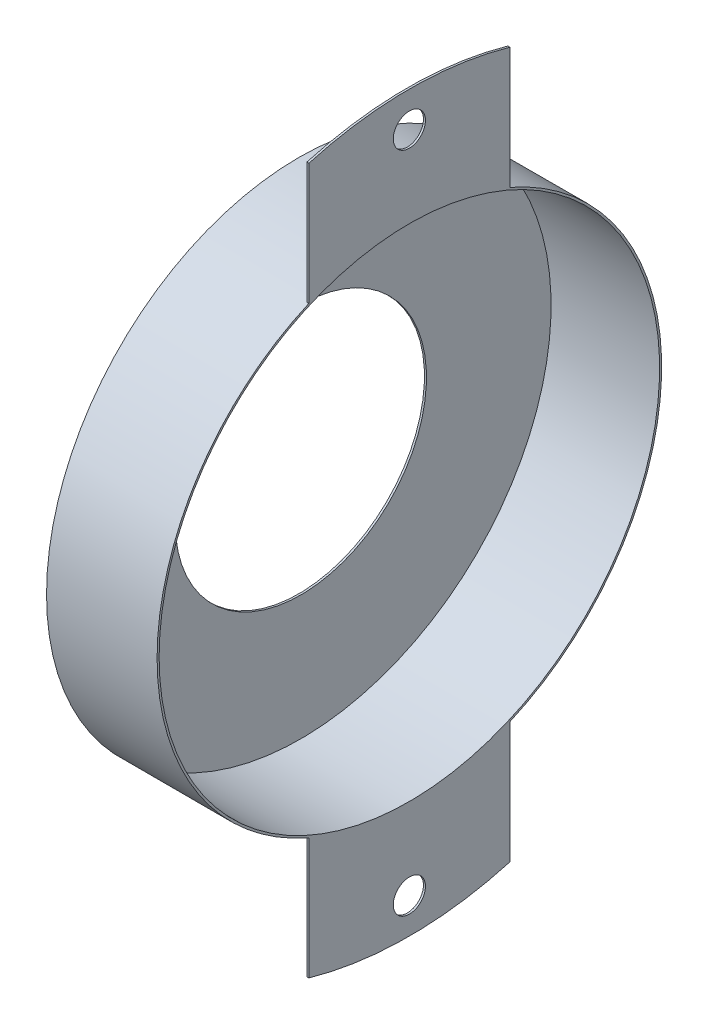
ISO-10303-21;
HEADER;
FILE_DESCRIPTION(('STEP AP214'),'2;1');
FILE_NAME('part.step','',(''),(''),'','','');
FILE_SCHEMA(('AUTOMOTIVE_DESIGN { 1 0 10303 214 1 1 1 1 }'));
ENDSEC;
DATA;
#1=APPLICATION_CONTEXT('core data for automotive mechanical design processes');
#2=APPLICATION_PROTOCOL_DEFINITION('international standard','automotive_design',2000,#1);
#3=PRODUCT_CONTEXT('',#1,'mechanical');
#4=PRODUCT('Part','Part','',(#3));
#5=PRODUCT_RELATED_PRODUCT_CATEGORY('part','',(#4));
#6=PRODUCT_DEFINITION_FORMATION('','',#4);
#7=PRODUCT_DEFINITION_CONTEXT('part definition',#1,'design');
#8=PRODUCT_DEFINITION('design','',#6,#7);
#9=PRODUCT_DEFINITION_SHAPE('','',#8);
#10=(LENGTH_UNIT() NAMED_UNIT(*) SI_UNIT(.MILLI.,.METRE.));
#11=(NAMED_UNIT(*) PLANE_ANGLE_UNIT() SI_UNIT($,.RADIAN.));
#12=(NAMED_UNIT(*) SI_UNIT($,.STERADIAN.) SOLID_ANGLE_UNIT());
#13=UNCERTAINTY_MEASURE_WITH_UNIT(LENGTH_MEASURE(1.E-05),#10,'distance_accuracy_value','');
#14=(GEOMETRIC_REPRESENTATION_CONTEXT(3) GLOBAL_UNCERTAINTY_ASSIGNED_CONTEXT((#13)) GLOBAL_UNIT_ASSIGNED_CONTEXT((#10,
#11,#12)) REPRESENTATION_CONTEXT('',''));
#15=CARTESIAN_POINT('',(0.,0.,0.));
#16=DIRECTION('',(0.,0.,1.));
#17=DIRECTION('',(1.,0.,0.));
#18=AXIS2_PLACEMENT_3D('',#15,#16,#17);
#19=CARTESIAN_POINT('',(10.9,24.9,0.));
#20=DIRECTION('',(-1.,0.,0.));
#21=DIRECTION('',(0.,0.,1.));
#22=AXIS2_PLACEMENT_3D('',#19,#20,#21);
#23=PLANE('',#22);
#24=CARTESIAN_POINT('',(10.9,33.,0.));
#25=DIRECTION('',(-1.,0.,0.));
#26=DIRECTION('',(0.,0.,1.));
#27=AXIS2_PLACEMENT_3D('',#24,#25,#26);
#28=CIRCLE('',#27,1.6);
#29=CARTESIAN_POINT('',(10.9,33.,1.6));
#30=VERTEX_POINT('',#29);
#31=EDGE_CURVE('E160',#30,#30,#28,.T.);
#32=ORIENTED_EDGE('',*,*,#31,.T.);
#33=EDGE_LOOP('',(#32));
#34=FACE_BOUND('',#33,.T.);
#35=CARTESIAN_POINT('',(10.9,-33.,0.));
#36=DIRECTION('',(-1.,0.,0.));
#37=DIRECTION('',(0.,0.,1.));
#38=AXIS2_PLACEMENT_3D('',#35,#36,#37);
#39=CIRCLE('',#38,1.6);
#40=CARTESIAN_POINT('',(10.9,-33.,1.6));
#41=VERTEX_POINT('',#40);
#42=EDGE_CURVE('E168',#41,#41,#39,.T.);
#43=ORIENTED_EDGE('',*,*,#42,.T.);
#44=EDGE_LOOP('',(#43));
#45=FACE_BOUND('',#44,.T.);
#46=CARTESIAN_POINT('',(10.9,0.,0.));
#47=DIRECTION('',(-1.,0.,0.));
#48=DIRECTION('',(0.,0.,1.));
#49=AXIS2_PLACEMENT_3D('',#46,#47,#48);
#50=CIRCLE('',#49,24.9);
#51=CARTESIAN_POINT('',(10.9,0.,24.9));
#52=VERTEX_POINT('',#51);
#53=EDGE_CURVE('E44',#52,#52,#50,.T.);
#54=ORIENTED_EDGE('',*,*,#53,.T.);
#55=EDGE_LOOP('',(#54));
#56=FACE_BOUND('',#55,.T.);
#57=DIRECTION('',(0.,-1.,0.));
#58=VECTOR('',#57,1.);
#59=CARTESIAN_POINT('',(10.9,0.,-10.));
#60=LINE('',#59,#58);
#61=CARTESIAN_POINT('',(10.9,35.1034186369362,-10.));
#62=VERTEX_POINT('',#61);
#63=CARTESIAN_POINT('',(10.9,23.0219460515396,-10.));
#64=VERTEX_POINT('',#63);
#65=EDGE_CURVE('E103',#62,#64,#60,.T.);
#66=ORIENTED_EDGE('',*,*,#65,.F.);
#67=CARTESIAN_POINT('',(10.9,0.,0.));
#68=DIRECTION('',(-1.,0.,0.));
#69=DIRECTION('',(0.,0.,1.));
#70=AXIS2_PLACEMENT_3D('',#67,#68,#69);
#71=CIRCLE('',#70,36.5);
#72=CARTESIAN_POINT('',(10.9,35.1034186369362,10.));
#73=VERTEX_POINT('',#72);
#74=EDGE_CURVE('E117',#73,#62,#71,.T.);
#75=ORIENTED_EDGE('',*,*,#74,.F.);
#76=DIRECTION('',(0.,-1.,0.));
#77=VECTOR('',#76,1.);
#78=CARTESIAN_POINT('',(10.9,0.,10.));
#79=LINE('',#78,#77);
#80=CARTESIAN_POINT('',(10.9,23.0219460515396,10.));
#81=VERTEX_POINT('',#80);
#82=EDGE_CURVE('E157',#73,#81,#79,.T.);
#83=ORIENTED_EDGE('',*,*,#82,.T.);
#84=CARTESIAN_POINT('',(10.9,0.,0.));
#85=DIRECTION('',(-1.,0.,0.));
#86=DIRECTION('',(0.,0.,1.));
#87=AXIS2_PLACEMENT_3D('',#84,#85,#86);
#88=CIRCLE('',#87,25.1);
#89=CARTESIAN_POINT('',(10.9,-23.0219460515396,10.));
#90=VERTEX_POINT('',#89);
#91=EDGE_CURVE('E150',#90,#81,#88,.T.);
#92=ORIENTED_EDGE('',*,*,#91,.F.);
#93=CARTESIAN_POINT('',(10.9,-35.1034186369362,10.));
#94=VERTEX_POINT('',#93);
#95=EDGE_CURVE('E158',#90,#94,#79,.T.);
#96=ORIENTED_EDGE('',*,*,#95,.T.);
#97=CARTESIAN_POINT('',(10.9,-35.1034186369362,-10.));
#98=VERTEX_POINT('',#97);
#99=EDGE_CURVE('E123',#98,#94,#71,.T.);
#100=ORIENTED_EDGE('',*,*,#99,.F.);
#101=CARTESIAN_POINT('',(10.9,-23.0219460515396,-10.));
#102=VERTEX_POINT('',#101);
#103=EDGE_CURVE('E119',#102,#98,#60,.T.);
#104=ORIENTED_EDGE('',*,*,#103,.F.);
#105=CARTESIAN_POINT('',(10.9,0.,0.));
#106=DIRECTION('',(-1.,0.,0.));
#107=DIRECTION('',(0.,0.,1.));
#108=AXIS2_PLACEMENT_3D('',#105,#106,#107);
#109=CIRCLE('',#108,25.1);
#110=EDGE_CURVE('E111',#64,#102,#109,.T.);
#111=ORIENTED_EDGE('',*,*,#110,.F.);
#112=EDGE_LOOP('',(#66,#75,#83,#92,#96,#100,#104,#111));
#113=FACE_BOUND('',#112,.T.);
#114=ADVANCED_FACE('F36',(#34,#45,#56,#113),#23,.F.);
#115=CARTESIAN_POINT('',(0.,0.,0.));
#116=DIRECTION('',(-1.,0.,0.));
#117=DIRECTION('',(0.,0.,1.));
#118=AXIS2_PLACEMENT_3D('',#115,#116,#117);
#119=CYLINDRICAL_SURFACE('',#118,36.5);
#120=DIRECTION('',(-1.,0.,0.));
#121=VECTOR('',#120,1.);
#122=CARTESIAN_POINT('',(10.9,35.1034186369362,-10.));
#123=LINE('',#122,#121);
#124=CARTESIAN_POINT('',(10.7,35.1034186369362,-10.));
#125=VERTEX_POINT('',#124);
#126=EDGE_CURVE('E100',#62,#125,#123,.T.);
#127=ORIENTED_EDGE('',*,*,#126,.T.);
#128=CARTESIAN_POINT('',(10.7,0.,0.));
#129=DIRECTION('',(-1.,0.,0.));
#130=DIRECTION('',(0.,0.,1.));
#131=AXIS2_PLACEMENT_3D('',#128,#129,#130);
#132=CIRCLE('',#131,36.5);
#133=CARTESIAN_POINT('',(10.7,35.1034186369362,10.));
#134=VERTEX_POINT('',#133);
#135=EDGE_CURVE('E127',#134,#125,#132,.T.);
#136=ORIENTED_EDGE('',*,*,#135,.F.);
#137=DIRECTION('',(-1.,0.,0.));
#138=VECTOR('',#137,1.);
#139=CARTESIAN_POINT('',(10.9,35.1034186369362,10.));
#140=LINE('',#139,#138);
#141=EDGE_CURVE('E59',#73,#134,#140,.T.);
#142=ORIENTED_EDGE('',*,*,#141,.F.);
#143=ORIENTED_EDGE('',*,*,#74,.T.);
#144=EDGE_LOOP('',(#127,#136,#142,#143));
#145=FACE_BOUND('',#144,.T.);
#146=ADVANCED_FACE('F122',(#145),#119,.T.);
#147=DIRECTION('',(-1.,0.,0.));
#148=VECTOR('',#147,1.);
#149=CARTESIAN_POINT('',(10.9,-35.1034186369362,-10.));
#150=LINE('',#149,#148);
#151=CARTESIAN_POINT('',(10.7,-35.1034186369362,-10.));
#152=VERTEX_POINT('',#151);
#153=EDGE_CURVE('E51',#98,#152,#150,.T.);
#154=ORIENTED_EDGE('',*,*,#153,.F.);
#155=ORIENTED_EDGE('',*,*,#99,.T.);
#156=DIRECTION('',(-1.,0.,0.));
#157=VECTOR('',#156,1.);
#158=CARTESIAN_POINT('',(10.9,-35.1034186369362,10.));
#159=LINE('',#158,#157);
#160=CARTESIAN_POINT('',(10.7,-35.1034186369362,10.));
#161=VERTEX_POINT('',#160);
#162=EDGE_CURVE('E147',#94,#161,#159,.T.);
#163=ORIENTED_EDGE('',*,*,#162,.T.);
#164=EDGE_CURVE('E130',#152,#161,#132,.T.);
#165=ORIENTED_EDGE('',*,*,#164,.F.);
#166=EDGE_LOOP('',(#154,#155,#163,#165));
#167=FACE_BOUND('',#166,.T.);
#168=ADVANCED_FACE('F212',(#167),#119,.T.);
#169=CARTESIAN_POINT('',(10.7,25.1,0.));
#170=DIRECTION('',(1.,0.,0.));
#171=DIRECTION('',(0.,0.,-1.));
#172=AXIS2_PLACEMENT_3D('',#169,#170,#171);
#173=PLANE('',#172);
#174=CARTESIAN_POINT('',(10.7,33.,0.));
#175=DIRECTION('',(-1.,0.,0.));
#176=DIRECTION('',(0.,0.,1.));
#177=AXIS2_PLACEMENT_3D('',#174,#175,#176);
#178=CIRCLE('',#177,1.6);
#179=CARTESIAN_POINT('',(10.7,33.,1.6));
#180=VERTEX_POINT('',#179);
#181=EDGE_CURVE('E175',#180,#180,#178,.T.);
#182=ORIENTED_EDGE('',*,*,#181,.F.);
#183=EDGE_LOOP('',(#182));
#184=FACE_BOUND('',#183,.T.);
#185=DIRECTION('',(0.,1.,0.));
#186=VECTOR('',#185,1.);
#187=CARTESIAN_POINT('',(10.7,25.1,-10.));
#188=LINE('',#187,#186);
#189=CARTESIAN_POINT('',(10.7,23.0219460515396,-10.));
#190=VERTEX_POINT('',#189);
#191=EDGE_CURVE('E106',#190,#125,#188,.T.);
#192=ORIENTED_EDGE('',*,*,#191,.F.);
#193=CARTESIAN_POINT('',(10.7,0.,0.));
#194=DIRECTION('',(-1.,0.,0.));
#195=DIRECTION('',(0.,0.,1.));
#196=AXIS2_PLACEMENT_3D('',#193,#194,#195);
#197=CIRCLE('',#196,25.1);
#198=CARTESIAN_POINT('',(10.7,23.0219460515396,10.));
#199=VERTEX_POINT('',#198);
#200=EDGE_CURVE('E131',#199,#190,#197,.T.);
#201=ORIENTED_EDGE('',*,*,#200,.F.);
#202=DIRECTION('',(0.,1.,0.));
#203=VECTOR('',#202,1.);
#204=CARTESIAN_POINT('',(10.7,25.1,10.));
#205=LINE('',#204,#203);
#206=EDGE_CURVE('E144',#199,#134,#205,.T.);
#207=ORIENTED_EDGE('',*,*,#206,.T.);
#208=ORIENTED_EDGE('',*,*,#135,.T.);
#209=EDGE_LOOP('',(#192,#201,#207,#208));
#210=FACE_BOUND('',#209,.T.);
#211=ADVANCED_FACE('F215',(#184,#210),#173,.F.);
#212=CARTESIAN_POINT('',(10.7,-33.,0.));
#213=DIRECTION('',(-1.,0.,0.));
#214=DIRECTION('',(0.,0.,1.));
#215=AXIS2_PLACEMENT_3D('',#212,#213,#214);
#216=CIRCLE('',#215,1.6);
#217=CARTESIAN_POINT('',(10.7,-33.,1.6));
#218=VERTEX_POINT('',#217);
#219=EDGE_CURVE('E171',#218,#218,#216,.T.);
#220=ORIENTED_EDGE('',*,*,#219,.F.);
#221=EDGE_LOOP('',(#220));
#222=FACE_BOUND('',#221,.T.);
#223=DIRECTION('',(0.,1.,0.));
#224=VECTOR('',#223,1.);
#225=CARTESIAN_POINT('',(10.7,25.1,-10.));
#226=LINE('',#225,#224);
#227=CARTESIAN_POINT('',(10.7,-23.0219460515396,-10.));
#228=VERTEX_POINT('',#227);
#229=EDGE_CURVE('E139',#152,#228,#226,.T.);
#230=ORIENTED_EDGE('',*,*,#229,.F.);
#231=ORIENTED_EDGE('',*,*,#164,.T.);
#232=DIRECTION('',(0.,1.,0.));
#233=VECTOR('',#232,1.);
#234=CARTESIAN_POINT('',(10.7,25.1,10.));
#235=LINE('',#234,#233);
#236=CARTESIAN_POINT('',(10.7,-23.0219460515396,10.));
#237=VERTEX_POINT('',#236);
#238=EDGE_CURVE('E141',#161,#237,#235,.T.);
#239=ORIENTED_EDGE('',*,*,#238,.T.);
#240=EDGE_CURVE('E134',#228,#237,#197,.T.);
#241=ORIENTED_EDGE('',*,*,#240,.F.);
#242=EDGE_LOOP('',(#230,#231,#239,#241));
#243=FACE_BOUND('',#242,.T.);
#244=ADVANCED_FACE('F217',(#222,#243),#173,.F.);
#245=CARTESIAN_POINT('',(0.1,0.,0.));
#246=DIRECTION('',(-1.,0.,0.));
#247=DIRECTION('',(0.,0.,1.));
#248=AXIS2_PLACEMENT_3D('',#245,#246,#247);
#249=PLANE('',#248);
#250=CARTESIAN_POINT('',(0.0999999999999994,0.,0.));
#251=DIRECTION('',(-1.,0.,0.));
#252=DIRECTION('',(0.,0.,1.));
#253=AXIS2_PLACEMENT_3D('',#250,#251,#252);
#254=CIRCLE('',#253,12.5);
#255=CARTESIAN_POINT('',(0.0999999999999994,0.,12.5));
#256=VERTEX_POINT('',#255);
#257=EDGE_CURVE('E172',#256,#256,#254,.T.);
#258=ORIENTED_EDGE('',*,*,#257,.T.);
#259=EDGE_LOOP('',(#258));
#260=FACE_BOUND('',#259,.T.);
#261=CARTESIAN_POINT('',(0.1,0.,0.));
#262=DIRECTION('',(-1.,0.,0.));
#263=DIRECTION('',(0.,0.,1.));
#264=AXIS2_PLACEMENT_3D('',#261,#262,#263);
#265=CIRCLE('',#264,24.9);
#266=CARTESIAN_POINT('',(0.1,0.,24.9));
#267=VERTEX_POINT('',#266);
#268=EDGE_CURVE('E11',#267,#267,#265,.T.);
#269=ORIENTED_EDGE('',*,*,#268,.F.);
#270=EDGE_LOOP('',(#269));
#271=FACE_BOUND('',#270,.T.);
#272=ADVANCED_FACE('F38',(#260,#271),#249,.F.);
#273=CARTESIAN_POINT('',(0.,0.,0.));
#274=DIRECTION('',(-1.,0.,0.));
#275=DIRECTION('',(0.,0.,1.));
#276=AXIS2_PLACEMENT_3D('',#273,#274,#275);
#277=CYLINDRICAL_SURFACE('',#276,24.9);
#278=ORIENTED_EDGE('',*,*,#53,.F.);
#279=EDGE_LOOP('',(#278));
#280=FACE_BOUND('',#279,.T.);
#281=ORIENTED_EDGE('',*,*,#268,.T.);
#282=EDGE_LOOP('',(#281));
#283=FACE_BOUND('',#282,.T.);
#284=ADVANCED_FACE('F198',(#280,#283),#277,.F.);
#285=CARTESIAN_POINT('',(0.,0.,0.));
#286=DIRECTION('',(-1.,0.,0.));
#287=DIRECTION('',(0.,0.,1.));
#288=AXIS2_PLACEMENT_3D('',#285,#286,#287);
#289=CYLINDRICAL_SURFACE('',#288,25.1);
#290=ORIENTED_EDGE('',*,*,#200,.T.);
#291=DIRECTION('',(-1.,0.,0.));
#292=VECTOR('',#291,1.);
#293=CARTESIAN_POINT('',(10.9,23.0219460515396,-10.));
#294=LINE('',#293,#292);
#295=EDGE_CURVE('E146',#64,#190,#294,.T.);
#296=ORIENTED_EDGE('',*,*,#295,.F.);
#297=ORIENTED_EDGE('',*,*,#110,.T.);
#298=DIRECTION('',(-1.,0.,0.));
#299=VECTOR('',#298,1.);
#300=CARTESIAN_POINT('',(10.9,-23.0219460515396,-10.));
#301=LINE('',#300,#299);
#302=EDGE_CURVE('E163',#102,#228,#301,.T.);
#303=ORIENTED_EDGE('',*,*,#302,.T.);
#304=ORIENTED_EDGE('',*,*,#240,.T.);
#305=DIRECTION('',(-1.,0.,0.));
#306=VECTOR('',#305,1.);
#307=CARTESIAN_POINT('',(10.9,-23.0219460515396,10.));
#308=LINE('',#307,#306);
#309=EDGE_CURVE('E120',#90,#237,#308,.T.);
#310=ORIENTED_EDGE('',*,*,#309,.F.);
#311=ORIENTED_EDGE('',*,*,#91,.T.);
#312=DIRECTION('',(-1.,0.,0.));
#313=VECTOR('',#312,1.);
#314=CARTESIAN_POINT('',(10.9,23.0219460515396,10.));
#315=LINE('',#314,#313);
#316=EDGE_CURVE('E152',#81,#199,#315,.T.);
#317=ORIENTED_EDGE('',*,*,#316,.T.);
#318=EDGE_LOOP('',(#290,#296,#297,#303,#304,#310,#311,#317));
#319=FACE_BOUND('',#318,.T.);
#320=CARTESIAN_POINT('',(-0.1,0.,0.));
#321=DIRECTION('',(-1.,0.,0.));
#322=DIRECTION('',(0.,0.,1.));
#323=AXIS2_PLACEMENT_3D('',#320,#321,#322);
#324=CIRCLE('',#323,25.1);
#325=CARTESIAN_POINT('',(-0.1,0.,25.1));
#326=VERTEX_POINT('',#325);
#327=EDGE_CURVE('E135',#326,#326,#324,.T.);
#328=ORIENTED_EDGE('',*,*,#327,.F.);
#329=EDGE_LOOP('',(#328));
#330=FACE_BOUND('',#329,.T.);
#331=ADVANCED_FACE('F193',(#319,#330),#289,.T.);
#332=CARTESIAN_POINT('',(-0.1,0.,0.));
#333=DIRECTION('',(1.,0.,0.));
#334=DIRECTION('',(0.,0.,-1.));
#335=AXIS2_PLACEMENT_3D('',#332,#333,#334);
#336=PLANE('',#335);
#337=CARTESIAN_POINT('',(-0.1,0.,0.));
#338=DIRECTION('',(-1.,0.,0.));
#339=DIRECTION('',(0.,0.,1.));
#340=AXIS2_PLACEMENT_3D('',#337,#338,#339);
#341=CIRCLE('',#340,12.5);
#342=CARTESIAN_POINT('',(-0.1,0.,12.5));
#343=VERTEX_POINT('',#342);
#344=EDGE_CURVE('E182',#343,#343,#341,.T.);
#345=ORIENTED_EDGE('',*,*,#344,.F.);
#346=EDGE_LOOP('',(#345));
#347=FACE_BOUND('',#346,.T.);
#348=ORIENTED_EDGE('',*,*,#327,.T.);
#349=EDGE_LOOP('',(#348));
#350=FACE_BOUND('',#349,.T.);
#351=ADVANCED_FACE('F189',(#347,#350),#336,.F.);
#352=CARTESIAN_POINT('',(10.9,0.,10.));
#353=DIRECTION('',(0.,0.,-1.));
#354=DIRECTION('',(0.,1.,0.));
#355=AXIS2_PLACEMENT_3D('',#352,#353,#354);
#356=PLANE('',#355);
#357=ORIENTED_EDGE('',*,*,#162,.F.);
#358=ORIENTED_EDGE('',*,*,#95,.F.);
#359=ORIENTED_EDGE('',*,*,#309,.T.);
#360=ORIENTED_EDGE('',*,*,#238,.F.);
#361=EDGE_LOOP('',(#357,#358,#359,#360));
#362=FACE_BOUND('',#361,.T.);
#363=ADVANCED_FACE('F192',(#362),#356,.F.);
#364=ORIENTED_EDGE('',*,*,#316,.F.);
#365=ORIENTED_EDGE('',*,*,#82,.F.);
#366=ORIENTED_EDGE('',*,*,#141,.T.);
#367=ORIENTED_EDGE('',*,*,#206,.F.);
#368=EDGE_LOOP('',(#364,#365,#366,#367));
#369=FACE_BOUND('',#368,.T.);
#370=ADVANCED_FACE('F230',(#369),#356,.F.);
#371=CARTESIAN_POINT('',(10.9,0.,-10.));
#372=DIRECTION('',(0.,0.,-1.));
#373=DIRECTION('',(0.,1.,0.));
#374=AXIS2_PLACEMENT_3D('',#371,#372,#373);
#375=PLANE('',#374);
#376=ORIENTED_EDGE('',*,*,#191,.T.);
#377=ORIENTED_EDGE('',*,*,#126,.F.);
#378=ORIENTED_EDGE('',*,*,#65,.T.);
#379=ORIENTED_EDGE('',*,*,#295,.T.);
#380=EDGE_LOOP('',(#376,#377,#378,#379));
#381=FACE_BOUND('',#380,.T.);
#382=ADVANCED_FACE('F102',(#381),#375,.T.);
#383=ORIENTED_EDGE('',*,*,#229,.T.);
#384=ORIENTED_EDGE('',*,*,#302,.F.);
#385=ORIENTED_EDGE('',*,*,#103,.T.);
#386=ORIENTED_EDGE('',*,*,#153,.T.);
#387=EDGE_LOOP('',(#383,#384,#385,#386));
#388=FACE_BOUND('',#387,.T.);
#389=ADVANCED_FACE('F240',(#388),#375,.T.);
#390=CARTESIAN_POINT('',(10.9,-33.,0.));
#391=DIRECTION('',(-1.,0.,0.));
#392=DIRECTION('',(0.,0.,1.));
#393=AXIS2_PLACEMENT_3D('',#390,#391,#392);
#394=CYLINDRICAL_SURFACE('',#393,1.6);
#395=ORIENTED_EDGE('',*,*,#42,.F.);
#396=EDGE_LOOP('',(#395));
#397=FACE_BOUND('',#396,.T.);
#398=ORIENTED_EDGE('',*,*,#219,.T.);
#399=EDGE_LOOP('',(#398));
#400=FACE_BOUND('',#399,.T.);
#401=ADVANCED_FACE('F249',(#397,#400),#394,.F.);
#402=CARTESIAN_POINT('',(10.9,33.,0.));
#403=DIRECTION('',(-1.,0.,0.));
#404=DIRECTION('',(0.,0.,1.));
#405=AXIS2_PLACEMENT_3D('',#402,#403,#404);
#406=CYLINDRICAL_SURFACE('',#405,1.6);
#407=ORIENTED_EDGE('',*,*,#31,.F.);
#408=EDGE_LOOP('',(#407));
#409=FACE_BOUND('',#408,.T.);
#410=ORIENTED_EDGE('',*,*,#181,.T.);
#411=EDGE_LOOP('',(#410));
#412=FACE_BOUND('',#411,.T.);
#413=ADVANCED_FACE('F252',(#409,#412),#406,.F.);
#414=CARTESIAN_POINT('',(9.9,0.,0.));
#415=DIRECTION('',(-1.,0.,0.));
#416=DIRECTION('',(0.,0.,1.));
#417=AXIS2_PLACEMENT_3D('',#414,#415,#416);
#418=CYLINDRICAL_SURFACE('',#417,12.5);
#419=ORIENTED_EDGE('',*,*,#344,.T.);
#420=EDGE_LOOP('',(#419));
#421=FACE_BOUND('',#420,.T.);
#422=ORIENTED_EDGE('',*,*,#257,.F.);
#423=EDGE_LOOP('',(#422));
#424=FACE_BOUND('',#423,.T.);
#425=ADVANCED_FACE('F186',(#421,#424),#418,.F.);
#426=CLOSED_SHELL('',(#114,#146,#168,#211,#244,#272,#284,#331,#351,#363,#370,#382,#389,#401,
#413,#425));
#427=MANIFOLD_SOLID_BREP('B2',#426);
#428=ADVANCED_BREP_SHAPE_REPRESENTATION('',(#18,#427),#14);
#429=SHAPE_DEFINITION_REPRESENTATION(#9,#428);
ENDSEC;
END-ISO-10303-21;
